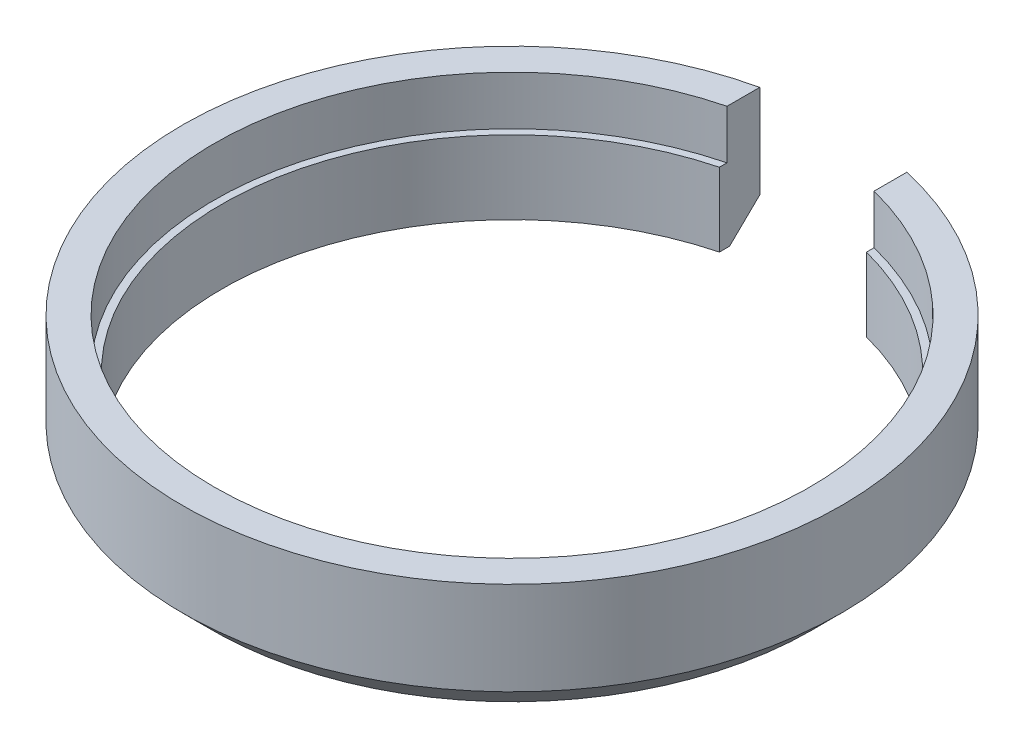
ISO-10303-21;
HEADER;
FILE_DESCRIPTION(('STEP AP214'),'2;1');
FILE_NAME('part.step','',(''),(''),'','','');
FILE_SCHEMA(('AUTOMOTIVE_DESIGN { 1 0 10303 214 1 1 1 1 }'));
ENDSEC;
DATA;
#1=APPLICATION_CONTEXT('core data for automotive mechanical design processes');
#2=APPLICATION_PROTOCOL_DEFINITION('international standard','automotive_design',2000,#1);
#3=PRODUCT_CONTEXT('',#1,'mechanical');
#4=PRODUCT('Part','Part','',(#3));
#5=PRODUCT_RELATED_PRODUCT_CATEGORY('part','',(#4));
#6=PRODUCT_DEFINITION_FORMATION('','',#4);
#7=PRODUCT_DEFINITION_CONTEXT('part definition',#1,'design');
#8=PRODUCT_DEFINITION('design','',#6,#7);
#9=PRODUCT_DEFINITION_SHAPE('','',#8);
#10=(LENGTH_UNIT() NAMED_UNIT(*) SI_UNIT(.MILLI.,.METRE.));
#11=(NAMED_UNIT(*) PLANE_ANGLE_UNIT() SI_UNIT($,.RADIAN.));
#12=(NAMED_UNIT(*) SI_UNIT($,.STERADIAN.) SOLID_ANGLE_UNIT());
#13=UNCERTAINTY_MEASURE_WITH_UNIT(LENGTH_MEASURE(1.E-05),#10,'distance_accuracy_value','');
#14=(GEOMETRIC_REPRESENTATION_CONTEXT(3) GLOBAL_UNCERTAINTY_ASSIGNED_CONTEXT((#13)) GLOBAL_UNIT_ASSIGNED_CONTEXT((#10,
#11,#12)) REPRESENTATION_CONTEXT('',''));
#15=CARTESIAN_POINT('',(0.,0.,0.));
#16=DIRECTION('',(0.,0.,1.));
#17=DIRECTION('',(1.,0.,0.));
#18=AXIS2_PLACEMENT_3D('',#15,#16,#17);
#19=CARTESIAN_POINT('',(0.,0.,0.));
#20=DIRECTION('',(0.,-1.,0.));
#21=DIRECTION('',(0.,0.,-1.));
#22=AXIS2_PLACEMENT_3D('',#19,#20,#21);
#23=CYLINDRICAL_SURFACE('',#22,11.85);
#24=CARTESIAN_POINT('',(0.,0.,0.));
#25=DIRECTION('',(0.,-1.,0.));
#26=DIRECTION('',(0.,0.,-1.));
#27=AXIS2_PLACEMENT_3D('',#24,#25,#26);
#28=CIRCLE('',#27,11.85);
#29=CARTESIAN_POINT('',(3.,0.,-11.4639652825713));
#30=VERTEX_POINT('',#29);
#31=CARTESIAN_POINT('',(-3.,0.,-11.4639652825713));
#32=VERTEX_POINT('',#31);
#33=EDGE_CURVE('E122',#30,#32,#28,.T.);
#34=ORIENTED_EDGE('',*,*,#33,.T.);
#35=DIRECTION('',(0.,-1.,0.));
#36=VECTOR('',#35,1.);
#37=CARTESIAN_POINT('',(-3.,0.,-11.4639652825713));
#38=LINE('',#37,#36);
#39=CARTESIAN_POINT('',(-3.,3.,-11.4639652825713));
#40=VERTEX_POINT('',#39);
#41=EDGE_CURVE('E106',#40,#32,#38,.T.);
#42=ORIENTED_EDGE('',*,*,#41,.F.);
#43=CARTESIAN_POINT('',(0.,3.,0.));
#44=DIRECTION('',(0.,-1.,0.));
#45=DIRECTION('',(0.,0.,-1.));
#46=AXIS2_PLACEMENT_3D('',#43,#44,#45);
#47=CIRCLE('',#46,11.85);
#48=CARTESIAN_POINT('',(3.,3.,-11.4639652825713));
#49=VERTEX_POINT('',#48);
#50=EDGE_CURVE('E124',#49,#40,#47,.T.);
#51=ORIENTED_EDGE('',*,*,#50,.F.);
#52=DIRECTION('',(0.,-1.,0.));
#53=VECTOR('',#52,1.);
#54=CARTESIAN_POINT('',(3.,0.,-11.4639652825713));
#55=LINE('',#54,#53);
#56=EDGE_CURVE('E170',#30,#49,#55,.F.);
#57=ORIENTED_EDGE('',*,*,#56,.F.);
#58=EDGE_LOOP('',(#34,#42,#51,#57));
#59=FACE_BOUND('',#58,.T.);
#60=ADVANCED_FACE('F36',(#59),#23,.F.);
#61=CARTESIAN_POINT('',(-11.85,0.,0.));
#62=DIRECTION('',(0.,1.,0.));
#63=DIRECTION('',(0.,0.,1.));
#64=AXIS2_PLACEMENT_3D('',#61,#62,#63);
#65=PLANE('',#64);
#66=CARTESIAN_POINT('',(0.,0.,0.));
#67=DIRECTION('',(0.,1.,0.));
#68=DIRECTION('',(0.,0.,1.));
#69=AXIS2_PLACEMENT_3D('',#66,#67,#68);
#70=CIRCLE('',#69,12.25);
#71=CARTESIAN_POINT('',(3.,0.,-11.8769735202197));
#72=VERTEX_POINT('',#71);
#73=CARTESIAN_POINT('',(-3.,0.,-11.8769735202197));
#74=VERTEX_POINT('',#73);
#75=EDGE_CURVE('E45',#72,#74,#70,.F.);
#76=ORIENTED_EDGE('',*,*,#75,.T.);
#77=DIRECTION('',(0.,0.,-1.));
#78=VECTOR('',#77,1.);
#79=CARTESIAN_POINT('',(-3.,0.,-17.));
#80=LINE('',#79,#78);
#81=EDGE_CURVE('E52',#32,#74,#80,.T.);
#82=ORIENTED_EDGE('',*,*,#81,.F.);
#83=ORIENTED_EDGE('',*,*,#33,.F.);
#84=DIRECTION('',(0.,0.,1.));
#85=VECTOR('',#84,1.);
#86=CARTESIAN_POINT('',(3.,0.,-17.));
#87=LINE('',#86,#85);
#88=EDGE_CURVE('E135',#72,#30,#87,.T.);
#89=ORIENTED_EDGE('',*,*,#88,.F.);
#90=EDGE_LOOP('',(#76,#82,#83,#89));
#91=FACE_BOUND('',#90,.T.);
#92=ADVANCED_FACE('F133',(#91),#65,.F.);
#93=CARTESIAN_POINT('',(0.,0.,0.));
#94=DIRECTION('',(0.,-1.,0.));
#95=DIRECTION('',(0.,0.,-1.));
#96=AXIS2_PLACEMENT_3D('',#93,#94,#95);
#97=CYLINDRICAL_SURFACE('',#96,13.45);
#98=CARTESIAN_POINT('',(0.,5.,0.));
#99=DIRECTION('',(0.,-1.,0.));
#100=DIRECTION('',(0.,0.,-1.));
#101=AXIS2_PLACEMENT_3D('',#98,#99,#100);
#102=CIRCLE('',#101,13.45);
#103=CARTESIAN_POINT('',(3.,5.,-13.1111593690261));
#104=VERTEX_POINT('',#103);
#105=CARTESIAN_POINT('',(-3.,5.,-13.1111593690261));
#106=VERTEX_POINT('',#105);
#107=EDGE_CURVE('E120',#104,#106,#102,.T.);
#108=ORIENTED_EDGE('',*,*,#107,.T.);
#109=DIRECTION('',(0.,-1.,0.));
#110=VECTOR('',#109,1.);
#111=CARTESIAN_POINT('',(-3.,0.,-13.1111593690261));
#112=LINE('',#111,#110);
#113=CARTESIAN_POINT('',(-3.,1.20000000000002,-13.1111593690261));
#114=VERTEX_POINT('',#113);
#115=EDGE_CURVE('E100',#114,#106,#112,.F.);
#116=ORIENTED_EDGE('',*,*,#115,.F.);
#117=CARTESIAN_POINT('',(0.,1.20000000000002,0.));
#118=DIRECTION('',(0.,1.,0.));
#119=DIRECTION('',(0.,0.,1.));
#120=AXIS2_PLACEMENT_3D('',#117,#118,#119);
#121=CIRCLE('',#120,13.45);
#122=CARTESIAN_POINT('',(3.,1.20000000000002,-13.1111593690261));
#123=VERTEX_POINT('',#122);
#124=EDGE_CURVE('E11',#114,#123,#121,.T.);
#125=ORIENTED_EDGE('',*,*,#124,.T.);
#126=DIRECTION('',(0.,-1.,0.));
#127=VECTOR('',#126,1.);
#128=CARTESIAN_POINT('',(3.,0.,-13.1111593690261));
#129=LINE('',#128,#127);
#130=EDGE_CURVE('E60',#104,#123,#129,.T.);
#131=ORIENTED_EDGE('',*,*,#130,.F.);
#132=EDGE_LOOP('',(#108,#116,#125,#131));
#133=FACE_BOUND('',#132,.T.);
#134=ADVANCED_FACE('F184',(#133),#97,.T.);
#135=CARTESIAN_POINT('',(-13.45,5.,0.));
#136=DIRECTION('',(0.,-1.,0.));
#137=DIRECTION('',(0.,0.,-1.));
#138=AXIS2_PLACEMENT_3D('',#135,#136,#137);
#139=PLANE('',#138);
#140=CARTESIAN_POINT('',(0.,5.,0.));
#141=DIRECTION('',(0.,-1.,0.));
#142=DIRECTION('',(0.,0.,-1.));
#143=AXIS2_PLACEMENT_3D('',#140,#141,#142);
#144=CIRCLE('',#143,12.15);
#145=CARTESIAN_POINT('',(3.,5.,-11.7738056719142));
#146=VERTEX_POINT('',#145);
#147=CARTESIAN_POINT('',(-3.,5.,-11.7738056719142));
#148=VERTEX_POINT('',#147);
#149=EDGE_CURVE('E113',#146,#148,#144,.T.);
#150=ORIENTED_EDGE('',*,*,#149,.T.);
#151=DIRECTION('',(0.,0.,1.));
#152=VECTOR('',#151,1.);
#153=CARTESIAN_POINT('',(-3.,5.,-17.));
#154=LINE('',#153,#152);
#155=EDGE_CURVE('E94',#106,#148,#154,.T.);
#156=ORIENTED_EDGE('',*,*,#155,.F.);
#157=ORIENTED_EDGE('',*,*,#107,.F.);
#158=DIRECTION('',(0.,0.,-1.));
#159=VECTOR('',#158,1.);
#160=CARTESIAN_POINT('',(3.,5.,-17.));
#161=LINE('',#160,#159);
#162=EDGE_CURVE('E105',#146,#104,#161,.T.);
#163=ORIENTED_EDGE('',*,*,#162,.F.);
#164=EDGE_LOOP('',(#150,#156,#157,#163));
#165=FACE_BOUND('',#164,.T.);
#166=ADVANCED_FACE('F119',(#165),#139,.F.);
#167=CARTESIAN_POINT('',(0.,0.,0.));
#168=DIRECTION('',(0.,-1.,0.));
#169=DIRECTION('',(0.,0.,-1.));
#170=AXIS2_PLACEMENT_3D('',#167,#168,#169);
#171=CYLINDRICAL_SURFACE('',#170,12.15);
#172=CARTESIAN_POINT('',(0.,3.,0.));
#173=DIRECTION('',(0.,-1.,0.));
#174=DIRECTION('',(0.,0.,-1.));
#175=AXIS2_PLACEMENT_3D('',#172,#173,#174);
#176=CIRCLE('',#175,12.15);
#177=CARTESIAN_POINT('',(3.,3.,-11.7738056719142));
#178=VERTEX_POINT('',#177);
#179=CARTESIAN_POINT('',(-3.,3.,-11.7738056719142));
#180=VERTEX_POINT('',#179);
#181=EDGE_CURVE('E115',#178,#180,#176,.T.);
#182=ORIENTED_EDGE('',*,*,#181,.T.);
#183=DIRECTION('',(0.,-1.,0.));
#184=VECTOR('',#183,1.);
#185=CARTESIAN_POINT('',(-3.,0.,-11.7738056719142));
#186=LINE('',#185,#184);
#187=EDGE_CURVE('E97',#148,#180,#186,.T.);
#188=ORIENTED_EDGE('',*,*,#187,.F.);
#189=ORIENTED_EDGE('',*,*,#149,.F.);
#190=DIRECTION('',(0.,-1.,0.));
#191=VECTOR('',#190,1.);
#192=CARTESIAN_POINT('',(3.,0.,-11.7738056719142));
#193=LINE('',#192,#191);
#194=EDGE_CURVE('E116',#178,#146,#193,.F.);
#195=ORIENTED_EDGE('',*,*,#194,.F.);
#196=EDGE_LOOP('',(#182,#188,#189,#195));
#197=FACE_BOUND('',#196,.T.);
#198=ADVANCED_FACE('F111',(#197),#171,.F.);
#199=CARTESIAN_POINT('',(-12.15,3.,0.));
#200=DIRECTION('',(0.,-1.,0.));
#201=DIRECTION('',(0.,0.,-1.));
#202=AXIS2_PLACEMENT_3D('',#199,#200,#201);
#203=PLANE('',#202);
#204=ORIENTED_EDGE('',*,*,#50,.T.);
#205=DIRECTION('',(0.,0.,1.));
#206=VECTOR('',#205,1.);
#207=CARTESIAN_POINT('',(-3.,3.,-17.));
#208=LINE('',#207,#206);
#209=EDGE_CURVE('E140',#180,#40,#208,.T.);
#210=ORIENTED_EDGE('',*,*,#209,.F.);
#211=ORIENTED_EDGE('',*,*,#181,.F.);
#212=DIRECTION('',(0.,0.,-1.));
#213=VECTOR('',#212,1.);
#214=CARTESIAN_POINT('',(3.,3.,-17.));
#215=LINE('',#214,#213);
#216=EDGE_CURVE('E172',#49,#178,#215,.T.);
#217=ORIENTED_EDGE('',*,*,#216,.F.);
#218=EDGE_LOOP('',(#204,#210,#211,#217));
#219=FACE_BOUND('',#218,.T.);
#220=ADVANCED_FACE('F177',(#219),#203,.F.);
#221=CARTESIAN_POINT('',(0.,0.,0.));
#222=DIRECTION('',(0.,1.,0.));
#223=DIRECTION('',(0.,0.,1.));
#224=AXIS2_PLACEMENT_3D('',#221,#222,#223);
#225=CONICAL_SURFACE('',#224,12.25,0.785398163397445);
#226=CARTESIAN_POINT('',(-3.,7.76087831858873,-19.7847226688009));
#227=CARTESIAN_POINT('',(-3.,7.15433547908864,-19.1712082115685));
#228=CARTESIAN_POINT('',(-3.,6.54807678089968,-18.5574119348734));
#229=CARTESIAN_POINT('',(-3.,5.33644086625652,-17.328979976287));
#230=CARTESIAN_POINT('',(-3.,4.73106362843047,-16.7143443154721));
#231=CARTESIAN_POINT('',(-3.,3.52157077953976,-15.484026150872));
#232=CARTESIAN_POINT('',(-3.,2.91745498188758,-14.8683438305783));
#233=CARTESIAN_POINT('',(-3.,1.71087313692222,-13.6353313539763));
#234=CARTESIAN_POINT('',(-3.,1.10840713335609,-13.0180011548127));
#235=CARTESIAN_POINT('',(-3.,0.206523737506691,-12.0900870193611));
#236=CARTESIAN_POINT('',(-3.,-0.0938397552153255,-11.7804227774043));
#237=CARTESIAN_POINT('',(-3.,-0.693764929996534,-11.1603202699505));
#238=CARTESIAN_POINT('',(-3.,-0.993326614791105,-10.8498820071012));
#239=CARTESIAN_POINT('',(-3.,-1.59140805043649,-10.2280413890297));
#240=CARTESIAN_POINT('',(-3.,-1.88992786709455,-9.91663909713171));
#241=CARTESIAN_POINT('',(-3.,-2.48563346809071,-9.29255223346241));
#242=CARTESIAN_POINT('',(-3.,-2.78281923509428,-8.97986764512948));
#243=CARTESIAN_POINT('',(-3.,-3.37546330702301,-8.35272013942463));
#244=CARTESIAN_POINT('',(-3.,-3.67092117344916,-8.03825680735986));
#245=CARTESIAN_POINT('',(-3.,-4.25933600465925,-7.40701357608695));
#246=CARTESIAN_POINT('',(-3.,-4.55229305867973,-7.09023376029315));
#247=CARTESIAN_POINT('',(-3.,-4.98904008299086,-6.61253804088605));
#248=CARTESIAN_POINT('',(-3.,-5.13419084857115,-6.4528666508257));
#249=CARTESIAN_POINT('',(-3.,-5.42336637260908,-6.13251020652482));
#250=CARTESIAN_POINT('',(-3.,-5.56739114467557,-5.9718251645779));
#251=CARTESIAN_POINT('',(-3.,-5.8540691820511,-5.64919888647864));
#252=CARTESIAN_POINT('',(-3.,-5.99672227989621,-5.48725750119624));
#253=CARTESIAN_POINT('',(-3.,-6.2802422919467,-5.16180795433087));
#254=CARTESIAN_POINT('',(-3.,-6.42110913118454,-4.99829972749142));
#255=CARTESIAN_POINT('',(-3.,-6.56087831858872,-4.83384996725222));
#256=B_SPLINE_CURVE_WITH_KNOTS('',3,(#226,#227,#228,#229,#230,#231,#232,#233,#234,#235,#236,
#237,#238,#239,#240,#241,#242,#243,#244,#245,#246,#247,#248,#249,#250,#251,#252,#253,#254,#255),
.UNSPECIFIED.,.F.,.F.,(4,2,2,2,2,2,2,2,2,2,2,2,2,2,4),(0.,2.58817553003681,5.17628722600697,
7.76398427901538,10.3517492972927,11.6459628685651,12.9401720189675,14.2342978879832,
15.5284405243776,16.8228984512286,18.1173099931995,18.7646644860357,19.4120111427663,
20.0594358536018,20.7068876468802),.UNSPECIFIED.);
#257=EDGE_CURVE('E139',#114,#74,#256,.T.);
#258=ORIENTED_EDGE('',*,*,#257,.T.);
#259=ORIENTED_EDGE('',*,*,#75,.F.);
#260=CARTESIAN_POINT('',(3.,-6.56087831858871,-4.83384996725222));
#261=CARTESIAN_POINT('',(3.,-6.47085952267105,-4.93978797847738));
#262=CARTESIAN_POINT('',(3.,-6.3803724154183,-5.04532592166467));
#263=CARTESIAN_POINT('',(3.,-6.19858972421589,-5.25570041885879));
#264=CARTESIAN_POINT('',(3.,-6.10729415378193,-5.36053698453985));
#265=CARTESIAN_POINT('',(3.,-5.83239440445547,-5.67413434825422));
#266=CARTESIAN_POINT('',(3.,-5.64776538916836,-5.881996632552));
#267=CARTESIAN_POINT('',(3.,-5.27651130345426,-6.29586292175821));
#268=CARTESIAN_POINT('',(3.,-5.08988657476155,-6.50186723402141));
#269=CARTESIAN_POINT('',(3.,-4.71507681067656,-6.91245724044817));
#270=CARTESIAN_POINT('',(3.,-4.5268917454406,-7.11704290734004));
#271=CARTESIAN_POINT('',(3.,-3.96061529807522,-7.72903702184584));
#272=CARTESIAN_POINT('',(3.,-3.58071939197709,-8.13477473659904));
#273=CARTESIAN_POINT('',(3.,-2.81782773714486,-8.94335736600145));
#274=CARTESIAN_POINT('',(3.,-2.43483182197473,-9.34620212311009));
#275=CARTESIAN_POINT('',(3.,-1.64676345025288,-10.1707466546502));
#276=CARTESIAN_POINT('',(3.,-1.2415780275878,-10.5923383854691));
#277=CARTESIAN_POINT('',(3.,-0.429563719582204,-11.4339361322105));
#278=CARTESIAN_POINT('',(3.,-0.0227348307636414,-11.8539421447738));
#279=CARTESIAN_POINT('',(3.,0.79211626952856,-12.6927814317495));
#280=CARTESIAN_POINT('',(3.,1.20013846187046,-13.1116147247553));
#281=CARTESIAN_POINT('',(3.,2.01708458328824,-13.9484010427036));
#282=CARTESIAN_POINT('',(3.,2.42600851286857,-14.3663540671534));
#283=CARTESIAN_POINT('',(3.,3.24469827124408,-15.2017291958751));
#284=CARTESIAN_POINT('',(3.,3.65446434986321,-15.6191510552487));
#285=CARTESIAN_POINT('',(3.,4.47454393758696,-16.4534569120263));
#286=CARTESIAN_POINT('',(3.,4.88485744691828,-16.8703409092075));
#287=CARTESIAN_POINT('',(3.,5.70591917043707,-17.7036754005481));
#288=CARTESIAN_POINT('',(3.,6.11666738189726,-18.1201258973952));
#289=CARTESIAN_POINT('',(3.,6.93852288191237,-18.9526716198035));
#290=CARTESIAN_POINT('',(3.,7.34963017010562,-19.3687668457218));
#291=CARTESIAN_POINT('',(3.,7.76087831858873,-19.7847226688009));
#292=B_SPLINE_CURVE_WITH_KNOTS('',3,(#260,#261,#262,#263,#264,#265,#266,#267,#268,#269,#270,
#271,#272,#273,#274,#275,#276,#277,#278,#279,#280,#281,#282,#283,#284,#285,#286,#287,#288,#289,
#290,#291),.UNSPECIFIED.,.F.,.F.,(4,2,2,2,2,2,2,2,2,2,2,2,2,2,2,4),(0.,0.417052776285291,
0.834098593488484,1.66813571999462,2.50203224764449,3.33594476172355,5.00339720740896,
6.67093977855351,8.42513752008975,10.1793389759605,11.9335124599598,13.6876869255046,
15.4424920507333,17.1972979028879,18.9520928101273,20.7068859519852),.UNSPECIFIED.);
#293=EDGE_CURVE('E138',#72,#123,#292,.T.);
#294=ORIENTED_EDGE('',*,*,#293,.T.);
#295=ORIENTED_EDGE('',*,*,#124,.F.);
#296=EDGE_LOOP('',(#258,#259,#294,#295));
#297=FACE_BOUND('',#296,.T.);
#298=ADVANCED_FACE('F39',(#297),#225,.T.);
#299=CARTESIAN_POINT('',(3.,-0.00100000000000013,-17.));
#300=DIRECTION('',(1.,0.,0.));
#301=DIRECTION('',(0.,0.,-1.));
#302=AXIS2_PLACEMENT_3D('',#299,#300,#301);
#303=PLANE('',#302);
#304=ORIENTED_EDGE('',*,*,#194,.T.);
#305=ORIENTED_EDGE('',*,*,#162,.T.);
#306=ORIENTED_EDGE('',*,*,#130,.T.);
#307=ORIENTED_EDGE('',*,*,#293,.F.);
#308=ORIENTED_EDGE('',*,*,#88,.T.);
#309=ORIENTED_EDGE('',*,*,#56,.T.);
#310=ORIENTED_EDGE('',*,*,#216,.T.);
#311=EDGE_LOOP('',(#304,#305,#306,#307,#308,#309,#310));
#312=FACE_BOUND('',#311,.T.);
#313=ADVANCED_FACE('F159',(#312),#303,.F.);
#314=CARTESIAN_POINT('',(-3.,-0.00100000000000013,-17.));
#315=DIRECTION('',(-1.,0.,0.));
#316=DIRECTION('',(0.,0.,1.));
#317=AXIS2_PLACEMENT_3D('',#314,#315,#316);
#318=PLANE('',#317);
#319=ORIENTED_EDGE('',*,*,#187,.T.);
#320=ORIENTED_EDGE('',*,*,#209,.T.);
#321=ORIENTED_EDGE('',*,*,#41,.T.);
#322=ORIENTED_EDGE('',*,*,#81,.T.);
#323=ORIENTED_EDGE('',*,*,#257,.F.);
#324=ORIENTED_EDGE('',*,*,#115,.T.);
#325=ORIENTED_EDGE('',*,*,#155,.T.);
#326=EDGE_LOOP('',(#319,#320,#321,#322,#323,#324,#325));
#327=FACE_BOUND('',#326,.T.);
#328=ADVANCED_FACE('F96',(#327),#318,.F.);
#329=CLOSED_SHELL('',(#60,#92,#134,#166,#198,#220,#298,#313,#328));
#330=MANIFOLD_SOLID_BREP('B2',#329);
#331=ADVANCED_BREP_SHAPE_REPRESENTATION('',(#18,#330),#14);
#332=SHAPE_DEFINITION_REPRESENTATION(#9,#331);
ENDSEC;
END-ISO-10303-21;
